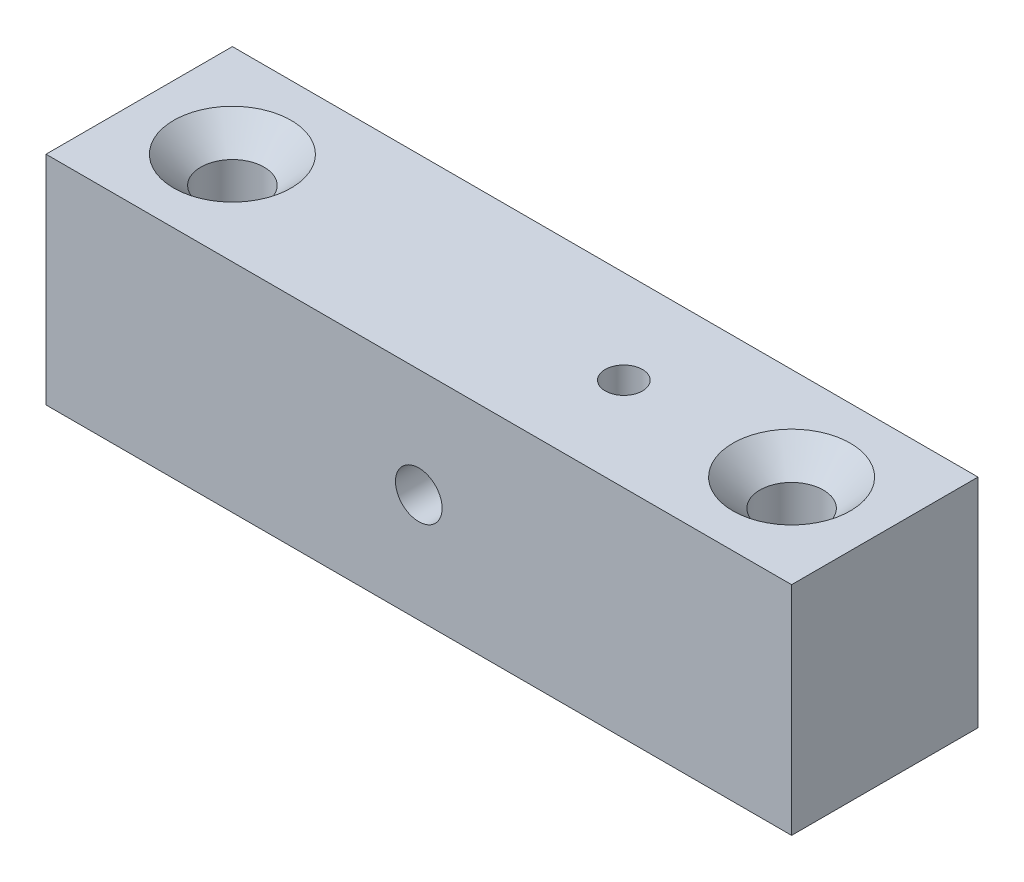
ISO-10303-21;
HEADER;
FILE_DESCRIPTION(('STEP AP214'),'2;1');
FILE_NAME('part.step','',(''),(''),'','','');
FILE_SCHEMA(('AUTOMOTIVE_DESIGN { 1 0 10303 214 1 1 1 1 }'));
ENDSEC;
DATA;
#1=APPLICATION_CONTEXT('core data for automotive mechanical design processes');
#2=APPLICATION_PROTOCOL_DEFINITION('international standard','automotive_design',2000,#1);
#3=PRODUCT_CONTEXT('',#1,'mechanical');
#4=PRODUCT('Part','Part','',(#3));
#5=PRODUCT_RELATED_PRODUCT_CATEGORY('part','',(#4));
#6=PRODUCT_DEFINITION_FORMATION('','',#4);
#7=PRODUCT_DEFINITION_CONTEXT('part definition',#1,'design');
#8=PRODUCT_DEFINITION('design','',#6,#7);
#9=PRODUCT_DEFINITION_SHAPE('','',#8);
#10=(LENGTH_UNIT() NAMED_UNIT(*) SI_UNIT(.MILLI.,.METRE.));
#11=(NAMED_UNIT(*) PLANE_ANGLE_UNIT() SI_UNIT($,.RADIAN.));
#12=(NAMED_UNIT(*) SI_UNIT($,.STERADIAN.) SOLID_ANGLE_UNIT());
#13=UNCERTAINTY_MEASURE_WITH_UNIT(LENGTH_MEASURE(1.E-05),#10,'distance_accuracy_value','');
#14=(GEOMETRIC_REPRESENTATION_CONTEXT(3) GLOBAL_UNCERTAINTY_ASSIGNED_CONTEXT((#13)) GLOBAL_UNIT_ASSIGNED_CONTEXT((#10,
#11,#12)) REPRESENTATION_CONTEXT('',''));
#15=CARTESIAN_POINT('',(0.,0.,0.));
#16=DIRECTION('',(0.,0.,1.));
#17=DIRECTION('',(1.,0.,0.));
#18=AXIS2_PLACEMENT_3D('',#15,#16,#17);
#19=CARTESIAN_POINT('',(0.,11.65,0.));
#20=DIRECTION('',(1.,0.,0.));
#21=DIRECTION('',(0.,0.,-1.));
#22=AXIS2_PLACEMENT_3D('',#19,#20,#21);
#23=PLANE('',#22);
#24=DIRECTION('',(0.,0.,1.));
#25=VECTOR('',#24,1.);
#26=CARTESIAN_POINT('',(0.,0.,0.));
#27=LINE('',#26,#25);
#28=CARTESIAN_POINT('',(0.,0.,-10.));
#29=VERTEX_POINT('',#28);
#30=CARTESIAN_POINT('',(0.,0.,0.));
#31=VERTEX_POINT('',#30);
#32=EDGE_CURVE('E98',#29,#31,#27,.T.);
#33=ORIENTED_EDGE('',*,*,#32,.T.);
#34=DIRECTION('',(0.,-1.,0.));
#35=VECTOR('',#34,1.);
#36=CARTESIAN_POINT('',(0.,11.65,0.));
#37=LINE('',#36,#35);
#38=CARTESIAN_POINT('',(0.,11.65,0.));
#39=VERTEX_POINT('',#38);
#40=EDGE_CURVE('E11',#39,#31,#37,.T.);
#41=ORIENTED_EDGE('',*,*,#40,.F.);
#42=DIRECTION('',(0.,0.,1.));
#43=VECTOR('',#42,1.);
#44=CARTESIAN_POINT('',(0.,11.65,0.));
#45=LINE('',#44,#43);
#46=CARTESIAN_POINT('',(0.,11.65,-10.));
#47=VERTEX_POINT('',#46);
#48=EDGE_CURVE('E86',#47,#39,#45,.T.);
#49=ORIENTED_EDGE('',*,*,#48,.F.);
#50=DIRECTION('',(0.,-1.,0.));
#51=VECTOR('',#50,1.);
#52=CARTESIAN_POINT('',(0.,11.65,-10.));
#53=LINE('',#52,#51);
#54=EDGE_CURVE('E94',#47,#29,#53,.T.);
#55=ORIENTED_EDGE('',*,*,#54,.T.);
#56=EDGE_LOOP('',(#33,#41,#49,#55));
#57=FACE_BOUND('',#56,.T.);
#58=ADVANCED_FACE('F35',(#57),#23,.F.);
#59=CARTESIAN_POINT('',(0.,11.65,0.));
#60=DIRECTION('',(0.,0.,-1.));
#61=DIRECTION('',(-1.,0.,0.));
#62=AXIS2_PLACEMENT_3D('',#59,#60,#61);
#63=PLANE('',#62);
#64=CARTESIAN_POINT('',(20.,5.825,0.));
#65=DIRECTION('',(0.,0.,-1.));
#66=DIRECTION('',(-1.,0.,0.));
#67=AXIS2_PLACEMENT_3D('',#64,#65,#66);
#68=CIRCLE('',#67,1.25);
#69=CARTESIAN_POINT('',(18.75,5.825,0.));
#70=VERTEX_POINT('',#69);
#71=EDGE_CURVE('E129',#70,#70,#68,.T.);
#72=ORIENTED_EDGE('',*,*,#71,.T.);
#73=EDGE_LOOP('',(#72));
#74=FACE_BOUND('',#73,.T.);
#75=DIRECTION('',(1.,0.,0.));
#76=VECTOR('',#75,1.);
#77=CARTESIAN_POINT('',(0.,0.,0.));
#78=LINE('',#77,#76);
#79=CARTESIAN_POINT('',(40.,0.,0.));
#80=VERTEX_POINT('',#79);
#81=EDGE_CURVE('E90',#31,#80,#78,.T.);
#82=ORIENTED_EDGE('',*,*,#81,.T.);
#83=DIRECTION('',(0.,-1.,0.));
#84=VECTOR('',#83,1.);
#85=CARTESIAN_POINT('',(40.,11.65,0.));
#86=LINE('',#85,#84);
#87=CARTESIAN_POINT('',(40.,11.65,0.));
#88=VERTEX_POINT('',#87);
#89=EDGE_CURVE('E43',#88,#80,#86,.T.);
#90=ORIENTED_EDGE('',*,*,#89,.F.);
#91=DIRECTION('',(1.,0.,0.));
#92=VECTOR('',#91,1.);
#93=CARTESIAN_POINT('',(0.,11.65,0.));
#94=LINE('',#93,#92);
#95=EDGE_CURVE('E81',#39,#88,#94,.T.);
#96=ORIENTED_EDGE('',*,*,#95,.F.);
#97=ORIENTED_EDGE('',*,*,#40,.T.);
#98=EDGE_LOOP('',(#82,#90,#96,#97));
#99=FACE_BOUND('',#98,.T.);
#100=ADVANCED_FACE('F89',(#74,#99),#63,.F.);
#101=CARTESIAN_POINT('',(40.,11.65,0.));
#102=DIRECTION('',(-1.,0.,0.));
#103=DIRECTION('',(0.,0.,1.));
#104=AXIS2_PLACEMENT_3D('',#101,#102,#103);
#105=PLANE('',#104);
#106=DIRECTION('',(0.,0.,-1.));
#107=VECTOR('',#106,1.);
#108=CARTESIAN_POINT('',(40.,0.,0.));
#109=LINE('',#108,#107);
#110=CARTESIAN_POINT('',(40.,0.,-10.));
#111=VERTEX_POINT('',#110);
#112=EDGE_CURVE('E68',#80,#111,#109,.T.);
#113=ORIENTED_EDGE('',*,*,#112,.T.);
#114=DIRECTION('',(0.,-1.,0.));
#115=VECTOR('',#114,1.);
#116=CARTESIAN_POINT('',(40.,11.65,-10.));
#117=LINE('',#116,#115);
#118=CARTESIAN_POINT('',(40.,11.65,-10.));
#119=VERTEX_POINT('',#118);
#120=EDGE_CURVE('E91',#119,#111,#117,.T.);
#121=ORIENTED_EDGE('',*,*,#120,.F.);
#122=DIRECTION('',(0.,0.,-1.));
#123=VECTOR('',#122,1.);
#124=CARTESIAN_POINT('',(40.,11.65,0.));
#125=LINE('',#124,#123);
#126=EDGE_CURVE('E84',#88,#119,#125,.T.);
#127=ORIENTED_EDGE('',*,*,#126,.F.);
#128=ORIENTED_EDGE('',*,*,#89,.T.);
#129=EDGE_LOOP('',(#113,#121,#127,#128));
#130=FACE_BOUND('',#129,.T.);
#131=ADVANCED_FACE('F92',(#130),#105,.F.);
#132=CARTESIAN_POINT('',(0.,11.65,-10.));
#133=DIRECTION('',(0.,0.,1.));
#134=DIRECTION('',(1.,0.,0.));
#135=AXIS2_PLACEMENT_3D('',#132,#133,#134);
#136=PLANE('',#135);
#137=CARTESIAN_POINT('',(20.,5.825,-10.));
#138=DIRECTION('',(0.,0.,-1.));
#139=DIRECTION('',(-1.,0.,0.));
#140=AXIS2_PLACEMENT_3D('',#137,#138,#139);
#141=CIRCLE('',#140,1.25);
#142=CARTESIAN_POINT('',(18.75,5.825,-10.));
#143=VERTEX_POINT('',#142);
#144=EDGE_CURVE('E132',#143,#143,#141,.T.);
#145=ORIENTED_EDGE('',*,*,#144,.F.);
#146=EDGE_LOOP('',(#145));
#147=FACE_BOUND('',#146,.T.);
#148=DIRECTION('',(-1.,0.,0.));
#149=VECTOR('',#148,1.);
#150=CARTESIAN_POINT('',(0.,0.,-10.));
#151=LINE('',#150,#149);
#152=EDGE_CURVE('E74',#111,#29,#151,.T.);
#153=ORIENTED_EDGE('',*,*,#152,.T.);
#154=ORIENTED_EDGE('',*,*,#54,.F.);
#155=DIRECTION('',(-1.,0.,0.));
#156=VECTOR('',#155,1.);
#157=CARTESIAN_POINT('',(0.,11.65,-10.));
#158=LINE('',#157,#156);
#159=EDGE_CURVE('E51',#119,#47,#158,.T.);
#160=ORIENTED_EDGE('',*,*,#159,.F.);
#161=ORIENTED_EDGE('',*,*,#120,.T.);
#162=EDGE_LOOP('',(#153,#154,#160,#161));
#163=FACE_BOUND('',#162,.T.);
#164=ADVANCED_FACE('F106',(#147,#163),#136,.F.);
#165=CARTESIAN_POINT('',(0.,11.65,0.));
#166=DIRECTION('',(0.,-1.,0.));
#167=DIRECTION('',(0.,0.,-1.));
#168=AXIS2_PLACEMENT_3D('',#165,#166,#167);
#169=PLANE('',#168);
#170=CARTESIAN_POINT('',(26.,11.65,-5.));
#171=DIRECTION('',(0.,1.,0.));
#172=DIRECTION('',(0.,0.,1.));
#173=AXIS2_PLACEMENT_3D('',#170,#171,#172);
#174=CIRCLE('',#173,0.999999999999997);
#175=CARTESIAN_POINT('',(26.,11.65,-4.));
#176=VERTEX_POINT('',#175);
#177=EDGE_CURVE('E138',#176,#176,#174,.T.);
#178=ORIENTED_EDGE('',*,*,#177,.F.);
#179=EDGE_LOOP('',(#178));
#180=FACE_BOUND('',#179,.T.);
#181=CARTESIAN_POINT('',(5.,11.65,-5.));
#182=DIRECTION('',(0.,1.,0.));
#183=DIRECTION('',(0.,0.,1.));
#184=AXIS2_PLACEMENT_3D('',#181,#182,#183);
#185=CIRCLE('',#184,3.15);
#186=CARTESIAN_POINT('',(5.,11.65,-1.85));
#187=VERTEX_POINT('',#186);
#188=EDGE_CURVE('E126',#187,#187,#185,.T.);
#189=ORIENTED_EDGE('',*,*,#188,.F.);
#190=EDGE_LOOP('',(#189));
#191=FACE_BOUND('',#190,.T.);
#192=CARTESIAN_POINT('',(35.,11.65,-5.));
#193=DIRECTION('',(0.,1.,0.));
#194=DIRECTION('',(0.,0.,1.));
#195=AXIS2_PLACEMENT_3D('',#192,#193,#194);
#196=CIRCLE('',#195,3.15);
#197=CARTESIAN_POINT('',(35.,11.65,-1.85));
#198=VERTEX_POINT('',#197);
#199=EDGE_CURVE('E117',#198,#198,#196,.T.);
#200=ORIENTED_EDGE('',*,*,#199,.F.);
#201=EDGE_LOOP('',(#200));
#202=FACE_BOUND('',#201,.T.);
#203=ORIENTED_EDGE('',*,*,#48,.T.);
#204=ORIENTED_EDGE('',*,*,#95,.T.);
#205=ORIENTED_EDGE('',*,*,#126,.T.);
#206=ORIENTED_EDGE('',*,*,#159,.T.);
#207=EDGE_LOOP('',(#203,#204,#205,#206));
#208=FACE_BOUND('',#207,.T.);
#209=ADVANCED_FACE('F82',(#180,#191,#202,#208),#169,.F.);
#210=CARTESIAN_POINT('',(0.,0.,0.));
#211=DIRECTION('',(0.,-1.,0.));
#212=DIRECTION('',(0.,0.,-1.));
#213=AXIS2_PLACEMENT_3D('',#210,#211,#212);
#214=PLANE('',#213);
#215=CARTESIAN_POINT('',(26.,0.,-5.));
#216=DIRECTION('',(0.,1.,0.));
#217=DIRECTION('',(0.,0.,1.));
#218=AXIS2_PLACEMENT_3D('',#215,#216,#217);
#219=CIRCLE('',#218,0.999999999999997);
#220=CARTESIAN_POINT('',(26.,0.,-4.));
#221=VERTEX_POINT('',#220);
#222=EDGE_CURVE('E135',#221,#221,#219,.T.);
#223=ORIENTED_EDGE('',*,*,#222,.T.);
#224=EDGE_LOOP('',(#223));
#225=FACE_BOUND('',#224,.T.);
#226=CARTESIAN_POINT('',(5.,0.,-5.));
#227=DIRECTION('',(0.,1.,0.));
#228=DIRECTION('',(0.,0.,1.));
#229=AXIS2_PLACEMENT_3D('',#226,#227,#228);
#230=CIRCLE('',#229,1.7);
#231=CARTESIAN_POINT('',(5.,0.,-3.3));
#232=VERTEX_POINT('',#231);
#233=EDGE_CURVE('E120',#232,#232,#230,.T.);
#234=ORIENTED_EDGE('',*,*,#233,.T.);
#235=EDGE_LOOP('',(#234));
#236=FACE_BOUND('',#235,.T.);
#237=CARTESIAN_POINT('',(35.,0.,-5.));
#238=DIRECTION('',(0.,1.,0.));
#239=DIRECTION('',(0.,0.,1.));
#240=AXIS2_PLACEMENT_3D('',#237,#238,#239);
#241=CIRCLE('',#240,1.69999999999999);
#242=CARTESIAN_POINT('',(35.,0.,-3.30000000000001));
#243=VERTEX_POINT('',#242);
#244=EDGE_CURVE('E101',#243,#243,#241,.T.);
#245=ORIENTED_EDGE('',*,*,#244,.T.);
#246=EDGE_LOOP('',(#245));
#247=FACE_BOUND('',#246,.T.);
#248=ORIENTED_EDGE('',*,*,#32,.F.);
#249=ORIENTED_EDGE('',*,*,#152,.F.);
#250=ORIENTED_EDGE('',*,*,#112,.F.);
#251=ORIENTED_EDGE('',*,*,#81,.F.);
#252=EDGE_LOOP('',(#248,#249,#250,#251));
#253=FACE_BOUND('',#252,.T.);
#254=ADVANCED_FACE('F109',(#225,#236,#247,#253),#214,.T.);
#255=CARTESIAN_POINT('',(35.,11.65,-5.));
#256=DIRECTION('',(0.,1.,0.));
#257=DIRECTION('',(0.,0.,1.));
#258=AXIS2_PLACEMENT_3D('',#255,#256,#257);
#259=CYLINDRICAL_SURFACE('',#258,1.7);
#260=ORIENTED_EDGE('',*,*,#244,.F.);
#261=EDGE_LOOP('',(#260));
#262=FACE_BOUND('',#261,.T.);
#263=CARTESIAN_POINT('',(35.,10.2,-5.));
#264=DIRECTION('',(0.,1.,0.));
#265=DIRECTION('',(0.,0.,1.));
#266=AXIS2_PLACEMENT_3D('',#263,#264,#265);
#267=CIRCLE('',#266,1.7);
#268=CARTESIAN_POINT('',(35.,10.2,-3.3));
#269=VERTEX_POINT('',#268);
#270=EDGE_CURVE('E114',#269,#269,#267,.T.);
#271=ORIENTED_EDGE('',*,*,#270,.T.);
#272=EDGE_LOOP('',(#271));
#273=FACE_BOUND('',#272,.T.);
#274=ADVANCED_FACE('F154',(#262,#273),#259,.F.);
#275=CARTESIAN_POINT('',(35.,11.65,-5.));
#276=DIRECTION('',(0.,1.,0.));
#277=DIRECTION('',(0.,0.,1.));
#278=AXIS2_PLACEMENT_3D('',#275,#276,#277);
#279=CONICAL_SURFACE('',#278,3.15,0.785398163397447);
#280=ORIENTED_EDGE('',*,*,#270,.F.);
#281=EDGE_LOOP('',(#280));
#282=FACE_BOUND('',#281,.T.);
#283=ORIENTED_EDGE('',*,*,#199,.T.);
#284=EDGE_LOOP('',(#283));
#285=FACE_BOUND('',#284,.T.);
#286=ADVANCED_FACE('F151',(#282,#285),#279,.F.);
#287=CARTESIAN_POINT('',(5.,11.65,-5.));
#288=DIRECTION('',(0.,1.,0.));
#289=DIRECTION('',(0.,0.,1.));
#290=AXIS2_PLACEMENT_3D('',#287,#288,#289);
#291=CYLINDRICAL_SURFACE('',#290,1.7);
#292=ORIENTED_EDGE('',*,*,#233,.F.);
#293=EDGE_LOOP('',(#292));
#294=FACE_BOUND('',#293,.T.);
#295=CARTESIAN_POINT('',(5.,10.2,-5.));
#296=DIRECTION('',(0.,1.,0.));
#297=DIRECTION('',(0.,0.,1.));
#298=AXIS2_PLACEMENT_3D('',#295,#296,#297);
#299=CIRCLE('',#298,1.7);
#300=CARTESIAN_POINT('',(5.,10.2,-3.3));
#301=VERTEX_POINT('',#300);
#302=EDGE_CURVE('E123',#301,#301,#299,.T.);
#303=ORIENTED_EDGE('',*,*,#302,.T.);
#304=EDGE_LOOP('',(#303));
#305=FACE_BOUND('',#304,.T.);
#306=ADVANCED_FACE('F153',(#294,#305),#291,.F.);
#307=CARTESIAN_POINT('',(5.,11.65,-5.));
#308=DIRECTION('',(0.,1.,0.));
#309=DIRECTION('',(0.,0.,1.));
#310=AXIS2_PLACEMENT_3D('',#307,#308,#309);
#311=CONICAL_SURFACE('',#310,3.15,0.785398163397448);
#312=ORIENTED_EDGE('',*,*,#302,.F.);
#313=EDGE_LOOP('',(#312));
#314=FACE_BOUND('',#313,.T.);
#315=ORIENTED_EDGE('',*,*,#188,.T.);
#316=EDGE_LOOP('',(#315));
#317=FACE_BOUND('',#316,.T.);
#318=ADVANCED_FACE('F161',(#314,#317),#311,.F.);
#319=CARTESIAN_POINT('',(20.,5.825,-10.));
#320=DIRECTION('',(0.,0.,-1.));
#321=DIRECTION('',(-1.,0.,0.));
#322=AXIS2_PLACEMENT_3D('',#319,#320,#321);
#323=CYLINDRICAL_SURFACE('',#322,1.25);
#324=ORIENTED_EDGE('',*,*,#71,.F.);
#325=EDGE_LOOP('',(#324));
#326=FACE_BOUND('',#325,.T.);
#327=ORIENTED_EDGE('',*,*,#144,.T.);
#328=EDGE_LOOP('',(#327));
#329=FACE_BOUND('',#328,.T.);
#330=ADVANCED_FACE('F195',(#326,#329),#323,.F.);
#331=CARTESIAN_POINT('',(26.,11.65,-5.));
#332=DIRECTION('',(0.,1.,0.));
#333=DIRECTION('',(0.,0.,1.));
#334=AXIS2_PLACEMENT_3D('',#331,#332,#333);
#335=CYLINDRICAL_SURFACE('',#334,0.999999999999997);
#336=ORIENTED_EDGE('',*,*,#222,.F.);
#337=EDGE_LOOP('',(#336));
#338=FACE_BOUND('',#337,.T.);
#339=ORIENTED_EDGE('',*,*,#177,.T.);
#340=EDGE_LOOP('',(#339));
#341=FACE_BOUND('',#340,.T.);
#342=ADVANCED_FACE('F142',(#338,#341),#335,.F.);
#343=CLOSED_SHELL('',(#58,#100,#131,#164,#209,#254,#274,#286,#306,#318,#330,#342));
#344=MANIFOLD_SOLID_BREP('B2',#343);
#345=ADVANCED_BREP_SHAPE_REPRESENTATION('',(#18,#344),#14);
#346=SHAPE_DEFINITION_REPRESENTATION(#9,#345);
ENDSEC;
END-ISO-10303-21;
